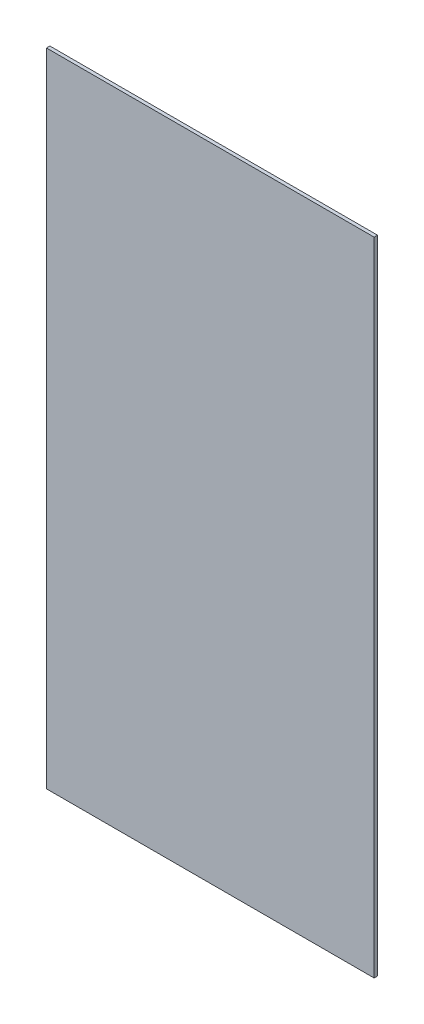
ISO-10303-21;
HEADER;
FILE_DESCRIPTION(('STEP AP214'),'2;1');
FILE_NAME('part.step','',(''),(''),'','','');
FILE_SCHEMA(('AUTOMOTIVE_DESIGN { 1 0 10303 214 1 1 1 1 }'));
ENDSEC;
DATA;
#1=APPLICATION_CONTEXT('core data for automotive mechanical design processes');
#2=APPLICATION_PROTOCOL_DEFINITION('international standard','automotive_design',2000,#1);
#3=PRODUCT_CONTEXT('',#1,'mechanical');
#4=PRODUCT('Part','Part','',(#3));
#5=PRODUCT_RELATED_PRODUCT_CATEGORY('part','',(#4));
#6=PRODUCT_DEFINITION_FORMATION('','',#4);
#7=PRODUCT_DEFINITION_CONTEXT('part definition',#1,'design');
#8=PRODUCT_DEFINITION('design','',#6,#7);
#9=PRODUCT_DEFINITION_SHAPE('','',#8);
#10=(LENGTH_UNIT() NAMED_UNIT(*) SI_UNIT(.MILLI.,.METRE.));
#11=(NAMED_UNIT(*) PLANE_ANGLE_UNIT() SI_UNIT($,.RADIAN.));
#12=(NAMED_UNIT(*) SI_UNIT($,.STERADIAN.) SOLID_ANGLE_UNIT());
#13=UNCERTAINTY_MEASURE_WITH_UNIT(LENGTH_MEASURE(1.E-05),#10,'distance_accuracy_value','');
#14=(GEOMETRIC_REPRESENTATION_CONTEXT(3) GLOBAL_UNCERTAINTY_ASSIGNED_CONTEXT((#13)) GLOBAL_UNIT_ASSIGNED_CONTEXT((#10,
#11,#12)) REPRESENTATION_CONTEXT('',''));
#15=CARTESIAN_POINT('',(0.,0.,0.));
#16=DIRECTION('',(0.,0.,1.));
#17=DIRECTION('',(1.,0.,0.));
#18=AXIS2_PLACEMENT_3D('',#15,#16,#17);
#19=CARTESIAN_POINT('',(0.,0.,-12.5));
#20=DIRECTION('',(1.,0.,0.));
#21=DIRECTION('',(0.,0.,-1.));
#22=AXIS2_PLACEMENT_3D('',#19,#20,#21);
#23=PLANE('',#22);
#24=DIRECTION('',(0.,1.,0.));
#25=VECTOR('',#24,1.);
#26=CARTESIAN_POINT('',(0.,0.,0.));
#27=LINE('',#26,#25);
#28=CARTESIAN_POINT('',(0.,0.,0.));
#29=VERTEX_POINT('',#28);
#30=CARTESIAN_POINT('',(0.,2350.,0.));
#31=VERTEX_POINT('',#30);
#32=EDGE_CURVE('E98',#29,#31,#27,.T.);
#33=ORIENTED_EDGE('',*,*,#32,.F.);
#34=DIRECTION('',(0.,0.,1.));
#35=VECTOR('',#34,1.);
#36=CARTESIAN_POINT('',(0.,0.,-12.5));
#37=LINE('',#36,#35);
#38=CARTESIAN_POINT('',(0.,0.,-12.5));
#39=VERTEX_POINT('',#38);
#40=EDGE_CURVE('E11',#39,#29,#37,.T.);
#41=ORIENTED_EDGE('',*,*,#40,.F.);
#42=DIRECTION('',(0.,1.,0.));
#43=VECTOR('',#42,1.);
#44=CARTESIAN_POINT('',(0.,0.,-12.5));
#45=LINE('',#44,#43);
#46=CARTESIAN_POINT('',(0.,2350.,-12.5));
#47=VERTEX_POINT('',#46);
#48=EDGE_CURVE('E92',#39,#47,#45,.T.);
#49=ORIENTED_EDGE('',*,*,#48,.T.);
#50=DIRECTION('',(0.,0.,1.));
#51=VECTOR('',#50,1.);
#52=CARTESIAN_POINT('',(0.,2350.,-12.5));
#53=LINE('',#52,#51);
#54=EDGE_CURVE('E37',#47,#31,#53,.T.);
#55=ORIENTED_EDGE('',*,*,#54,.T.);
#56=EDGE_LOOP('',(#33,#41,#49,#55));
#57=FACE_BOUND('',#56,.T.);
#58=ADVANCED_FACE('F34',(#57),#23,.T.);
#59=CARTESIAN_POINT('',(0.,0.,-12.5));
#60=DIRECTION('',(0.,-1.,0.));
#61=DIRECTION('',(1.,0.,0.));
#62=AXIS2_PLACEMENT_3D('',#59,#60,#61);
#63=PLANE('',#62);
#64=DIRECTION('',(1.,0.,0.));
#65=VECTOR('',#64,1.);
#66=CARTESIAN_POINT('',(0.,0.,0.));
#67=LINE('',#66,#65);
#68=CARTESIAN_POINT('',(-1200.,-1.46957615897682E-13,0.));
#69=VERTEX_POINT('',#68);
#70=EDGE_CURVE('E94',#69,#29,#67,.T.);
#71=ORIENTED_EDGE('',*,*,#70,.F.);
#72=DIRECTION('',(0.,0.,1.));
#73=VECTOR('',#72,1.);
#74=CARTESIAN_POINT('',(-1200.,-1.46957615897682E-13,-12.5));
#75=LINE('',#74,#73);
#76=CARTESIAN_POINT('',(-1200.,-1.46957615897682E-13,-12.5));
#77=VERTEX_POINT('',#76);
#78=EDGE_CURVE('E43',#77,#69,#75,.T.);
#79=ORIENTED_EDGE('',*,*,#78,.F.);
#80=DIRECTION('',(1.,0.,0.));
#81=VECTOR('',#80,1.);
#82=CARTESIAN_POINT('',(0.,0.,-12.5));
#83=LINE('',#82,#81);
#84=EDGE_CURVE('E89',#77,#39,#83,.T.);
#85=ORIENTED_EDGE('',*,*,#84,.T.);
#86=ORIENTED_EDGE('',*,*,#40,.T.);
#87=EDGE_LOOP('',(#71,#79,#85,#86));
#88=FACE_BOUND('',#87,.T.);
#89=ADVANCED_FACE('F108',(#88),#63,.T.);
#90=CARTESIAN_POINT('',(-1200.,-1.46957615897682E-13,-12.5));
#91=DIRECTION('',(-1.,0.,0.));
#92=DIRECTION('',(0.,0.,1.));
#93=AXIS2_PLACEMENT_3D('',#90,#91,#92);
#94=PLANE('',#93);
#95=DIRECTION('',(0.,-1.,0.));
#96=VECTOR('',#95,1.);
#97=CARTESIAN_POINT('',(-1200.,-1.46957615897682E-13,0.));
#98=LINE('',#97,#96);
#99=CARTESIAN_POINT('',(-1200.,2350.,0.));
#100=VERTEX_POINT('',#99);
#101=EDGE_CURVE('E84',#100,#69,#98,.T.);
#102=ORIENTED_EDGE('',*,*,#101,.F.);
#103=DIRECTION('',(0.,0.,1.));
#104=VECTOR('',#103,1.);
#105=CARTESIAN_POINT('',(-1200.,2350.,-12.5));
#106=LINE('',#105,#104);
#107=CARTESIAN_POINT('',(-1200.,2350.,-12.5));
#108=VERTEX_POINT('',#107);
#109=EDGE_CURVE('E79',#108,#100,#106,.T.);
#110=ORIENTED_EDGE('',*,*,#109,.F.);
#111=DIRECTION('',(0.,-1.,0.));
#112=VECTOR('',#111,1.);
#113=CARTESIAN_POINT('',(-1200.,-1.46957615897682E-13,-12.5));
#114=LINE('',#113,#112);
#115=EDGE_CURVE('E82',#108,#77,#114,.T.);
#116=ORIENTED_EDGE('',*,*,#115,.T.);
#117=ORIENTED_EDGE('',*,*,#78,.T.);
#118=EDGE_LOOP('',(#102,#110,#116,#117));
#119=FACE_BOUND('',#118,.T.);
#120=ADVANCED_FACE('F81',(#119),#94,.T.);
#121=CARTESIAN_POINT('',(0.,2350.,-12.5));
#122=DIRECTION('',(0.,1.,0.));
#123=DIRECTION('',(0.,0.,1.));
#124=AXIS2_PLACEMENT_3D('',#121,#122,#123);
#125=PLANE('',#124);
#126=DIRECTION('',(-1.,0.,0.));
#127=VECTOR('',#126,1.);
#128=CARTESIAN_POINT('',(0.,2350.,0.));
#129=LINE('',#128,#127);
#130=EDGE_CURVE('E101',#31,#100,#129,.T.);
#131=ORIENTED_EDGE('',*,*,#130,.F.);
#132=ORIENTED_EDGE('',*,*,#54,.F.);
#133=DIRECTION('',(-1.,0.,0.));
#134=VECTOR('',#133,1.);
#135=CARTESIAN_POINT('',(0.,2350.,-12.5));
#136=LINE('',#135,#134);
#137=EDGE_CURVE('E88',#47,#108,#136,.T.);
#138=ORIENTED_EDGE('',*,*,#137,.T.);
#139=ORIENTED_EDGE('',*,*,#109,.T.);
#140=EDGE_LOOP('',(#131,#132,#138,#139));
#141=FACE_BOUND('',#140,.T.);
#142=ADVANCED_FACE('F91',(#141),#125,.T.);
#143=CARTESIAN_POINT('',(0.,0.,-12.5));
#144=DIRECTION('',(0.,0.,1.));
#145=DIRECTION('',(1.,0.,0.));
#146=AXIS2_PLACEMENT_3D('',#143,#144,#145);
#147=PLANE('',#146);
#148=ORIENTED_EDGE('',*,*,#48,.F.);
#149=ORIENTED_EDGE('',*,*,#84,.F.);
#150=ORIENTED_EDGE('',*,*,#115,.F.);
#151=ORIENTED_EDGE('',*,*,#137,.F.);
#152=EDGE_LOOP('',(#148,#149,#150,#151));
#153=FACE_BOUND('',#152,.T.);
#154=ADVANCED_FACE('F87',(#153),#147,.F.);
#155=CARTESIAN_POINT('',(0.,0.,0.));
#156=DIRECTION('',(0.,0.,1.));
#157=DIRECTION('',(1.,0.,0.));
#158=AXIS2_PLACEMENT_3D('',#155,#156,#157);
#159=PLANE('',#158);
#160=ORIENTED_EDGE('',*,*,#32,.T.);
#161=ORIENTED_EDGE('',*,*,#130,.T.);
#162=ORIENTED_EDGE('',*,*,#101,.T.);
#163=ORIENTED_EDGE('',*,*,#70,.T.);
#164=EDGE_LOOP('',(#160,#161,#162,#163));
#165=FACE_BOUND('',#164,.T.);
#166=ADVANCED_FACE('F107',(#165),#159,.T.);
#167=CLOSED_SHELL('',(#58,#89,#120,#142,#154,#166));
#168=MANIFOLD_SOLID_BREP('B2',#167);
#169=ADVANCED_BREP_SHAPE_REPRESENTATION('',(#18,#168),#14);
#170=SHAPE_DEFINITION_REPRESENTATION(#9,#169);
ENDSEC;
END-ISO-10303-21;
